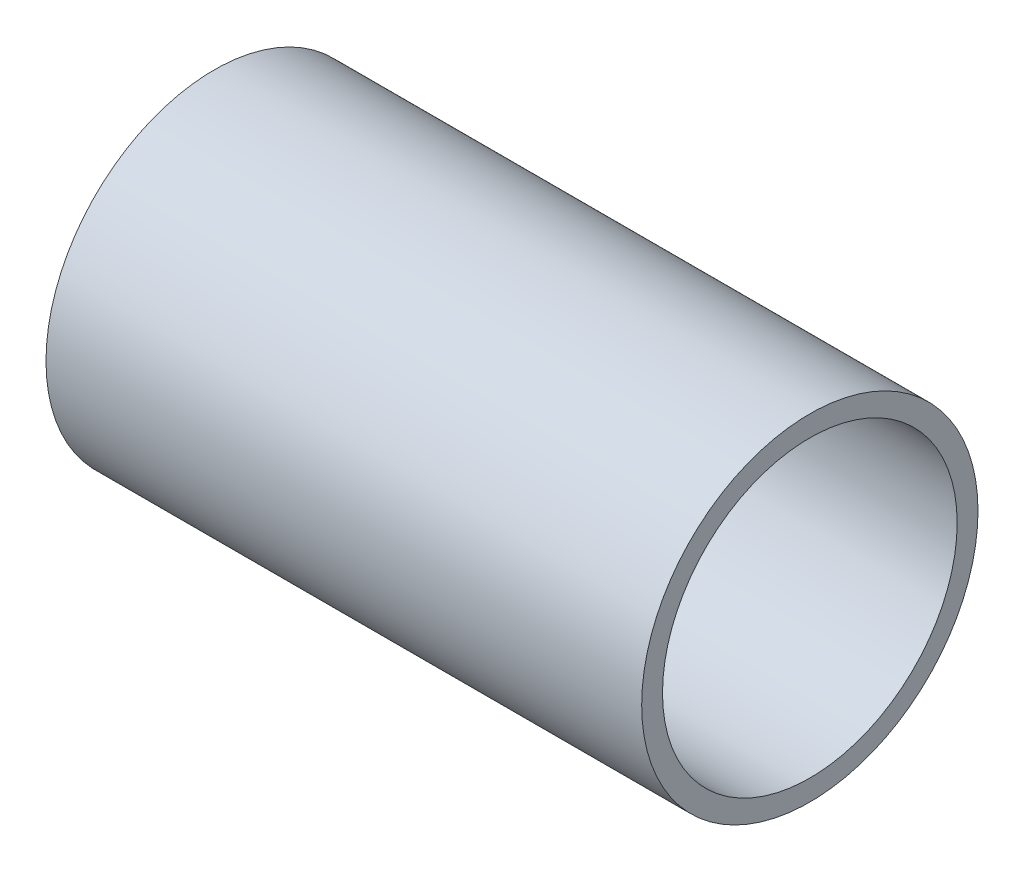
ISO-10303-21;
HEADER;
FILE_DESCRIPTION(('STEP AP214'),'2;1');
FILE_NAME('part.step','',(''),(''),'','','');
FILE_SCHEMA(('AUTOMOTIVE_DESIGN { 1 0 10303 214 1 1 1 1 }'));
ENDSEC;
DATA;
#1=APPLICATION_CONTEXT('core data for automotive mechanical design processes');
#2=APPLICATION_PROTOCOL_DEFINITION('international standard','automotive_design',2000,#1);
#3=PRODUCT_CONTEXT('',#1,'mechanical');
#4=PRODUCT('Part','Part','',(#3));
#5=PRODUCT_RELATED_PRODUCT_CATEGORY('part','',(#4));
#6=PRODUCT_DEFINITION_FORMATION('','',#4);
#7=PRODUCT_DEFINITION_CONTEXT('part definition',#1,'design');
#8=PRODUCT_DEFINITION('design','',#6,#7);
#9=PRODUCT_DEFINITION_SHAPE('','',#8);
#10=(LENGTH_UNIT() NAMED_UNIT(*) SI_UNIT(.MILLI.,.METRE.));
#11=(NAMED_UNIT(*) PLANE_ANGLE_UNIT() SI_UNIT($,.RADIAN.));
#12=(NAMED_UNIT(*) SI_UNIT($,.STERADIAN.) SOLID_ANGLE_UNIT());
#13=UNCERTAINTY_MEASURE_WITH_UNIT(LENGTH_MEASURE(1.E-05),#10,'distance_accuracy_value','');
#14=(GEOMETRIC_REPRESENTATION_CONTEXT(3) GLOBAL_UNCERTAINTY_ASSIGNED_CONTEXT((#13)) GLOBAL_UNIT_ASSIGNED_CONTEXT((#10,
#11,#12)) REPRESENTATION_CONTEXT('',''));
#15=CARTESIAN_POINT('',(0.,0.,0.));
#16=DIRECTION('',(0.,0.,1.));
#17=DIRECTION('',(1.,0.,0.));
#18=AXIS2_PLACEMENT_3D('',#15,#16,#17);
#19=CARTESIAN_POINT('',(227.0125,0.,0.));
#20=DIRECTION('',(1.,0.,0.));
#21=DIRECTION('',(0.,0.,-1.));
#22=AXIS2_PLACEMENT_3D('',#19,#20,#21);
#23=PLANE('',#22);
#24=CARTESIAN_POINT('',(227.0125,0.,0.));
#25=DIRECTION('',(1.,0.,0.));
#26=DIRECTION('',(0.,0.,-1.));
#27=AXIS2_PLACEMENT_3D('',#24,#25,#26);
#28=CIRCLE('',#27,64.0875);
#29=CARTESIAN_POINT('',(227.0125,0.,-64.0875));
#30=VERTEX_POINT('',#29);
#31=EDGE_CURVE('E10',#30,#30,#28,.T.);
#32=ORIENTED_EDGE('',*,*,#31,.T.);
#33=EDGE_LOOP('',(#32));
#34=FACE_BOUND('',#33,.T.);
#35=CARTESIAN_POINT('',(227.0125,0.,0.));
#36=DIRECTION('',(1.,0.,0.));
#37=DIRECTION('',(0.,0.,-1.));
#38=AXIS2_PLACEMENT_3D('',#35,#36,#37);
#39=CIRCLE('',#38,56.15);
#40=CARTESIAN_POINT('',(227.0125,0.,-56.15));
#41=VERTEX_POINT('',#40);
#42=EDGE_CURVE('E42',#41,#41,#39,.T.);
#43=ORIENTED_EDGE('',*,*,#42,.F.);
#44=EDGE_LOOP('',(#43));
#45=FACE_BOUND('',#44,.T.);
#46=ADVANCED_FACE('F31',(#34,#45),#23,.T.);
#47=CARTESIAN_POINT('',(0.,0.,0.));
#48=DIRECTION('',(1.,0.,0.));
#49=DIRECTION('',(0.,0.,-1.));
#50=AXIS2_PLACEMENT_3D('',#47,#48,#49);
#51=PLANE('',#50);
#52=CARTESIAN_POINT('',(0.,0.,0.));
#53=DIRECTION('',(1.,0.,0.));
#54=DIRECTION('',(0.,0.,-1.));
#55=AXIS2_PLACEMENT_3D('',#52,#53,#54);
#56=CIRCLE('',#55,64.0875);
#57=CARTESIAN_POINT('',(0.,0.,-64.0875));
#58=VERTEX_POINT('',#57);
#59=EDGE_CURVE('E35',#58,#58,#56,.T.);
#60=ORIENTED_EDGE('',*,*,#59,.F.);
#61=EDGE_LOOP('',(#60));
#62=FACE_BOUND('',#61,.T.);
#63=CARTESIAN_POINT('',(0.,0.,0.));
#64=DIRECTION('',(1.,0.,0.));
#65=DIRECTION('',(0.,0.,-1.));
#66=AXIS2_PLACEMENT_3D('',#63,#64,#65);
#67=CIRCLE('',#66,56.15);
#68=CARTESIAN_POINT('',(0.,0.,-56.15));
#69=VERTEX_POINT('',#68);
#70=EDGE_CURVE('E44',#69,#69,#67,.T.);
#71=ORIENTED_EDGE('',*,*,#70,.T.);
#72=EDGE_LOOP('',(#71));
#73=FACE_BOUND('',#72,.T.);
#74=ADVANCED_FACE('F54',(#62,#73),#51,.F.);
#75=CARTESIAN_POINT('',(227.0125,0.,0.));
#76=DIRECTION('',(-1.,0.,0.));
#77=DIRECTION('',(0.,0.,1.));
#78=AXIS2_PLACEMENT_3D('',#75,#76,#77);
#79=CYLINDRICAL_SURFACE('',#78,64.0875);
#80=ORIENTED_EDGE('',*,*,#31,.F.);
#81=EDGE_LOOP('',(#80));
#82=FACE_BOUND('',#81,.T.);
#83=ORIENTED_EDGE('',*,*,#59,.T.);
#84=EDGE_LOOP('',(#83));
#85=FACE_BOUND('',#84,.T.);
#86=ADVANCED_FACE('F33',(#82,#85),#79,.T.);
#87=CARTESIAN_POINT('',(227.0125,0.,0.));
#88=DIRECTION('',(-1.,0.,0.));
#89=DIRECTION('',(0.,0.,1.));
#90=AXIS2_PLACEMENT_3D('',#87,#88,#89);
#91=CYLINDRICAL_SURFACE('',#90,56.15);
#92=ORIENTED_EDGE('',*,*,#42,.T.);
#93=EDGE_LOOP('',(#92));
#94=FACE_BOUND('',#93,.T.);
#95=ORIENTED_EDGE('',*,*,#70,.F.);
#96=EDGE_LOOP('',(#95));
#97=FACE_BOUND('',#96,.T.);
#98=ADVANCED_FACE('F50',(#94,#97),#91,.F.);
#99=CLOSED_SHELL('',(#46,#74,#86,#98));
#100=MANIFOLD_SOLID_BREP('B2',#99);
#101=ADVANCED_BREP_SHAPE_REPRESENTATION('',(#18,#100),#14);
#102=SHAPE_DEFINITION_REPRESENTATION(#9,#101);
ENDSEC;
END-ISO-10303-21;
